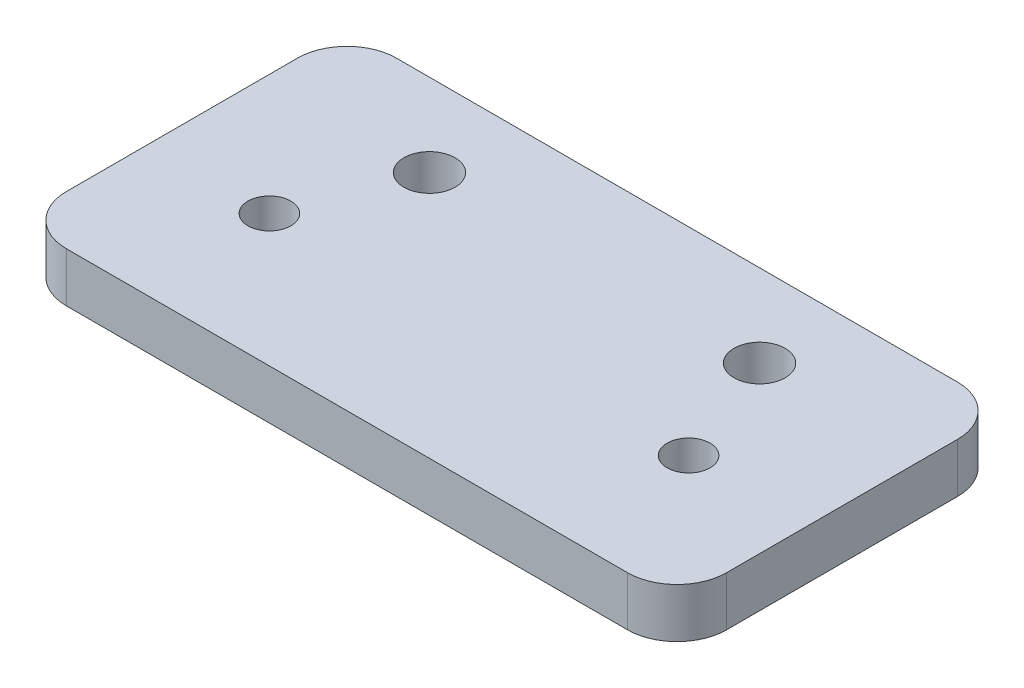
ISO-10303-21;
HEADER;
FILE_DESCRIPTION(('STEP AP214'),'2;1');
FILE_NAME('part.step','',(''),(''),'','','');
FILE_SCHEMA(('AUTOMOTIVE_DESIGN { 1 0 10303 214 1 1 1 1 }'));
ENDSEC;
DATA;
#1=APPLICATION_CONTEXT('core data for automotive mechanical design processes');
#2=APPLICATION_PROTOCOL_DEFINITION('international standard','automotive_design',2000,#1);
#3=PRODUCT_CONTEXT('',#1,'mechanical');
#4=PRODUCT('Part','Part','',(#3));
#5=PRODUCT_RELATED_PRODUCT_CATEGORY('part','',(#4));
#6=PRODUCT_DEFINITION_FORMATION('','',#4);
#7=PRODUCT_DEFINITION_CONTEXT('part definition',#1,'design');
#8=PRODUCT_DEFINITION('design','',#6,#7);
#9=PRODUCT_DEFINITION_SHAPE('','',#8);
#10=(LENGTH_UNIT() NAMED_UNIT(*) SI_UNIT(.MILLI.,.METRE.));
#11=(NAMED_UNIT(*) PLANE_ANGLE_UNIT() SI_UNIT($,.RADIAN.));
#12=(NAMED_UNIT(*) SI_UNIT($,.STERADIAN.) SOLID_ANGLE_UNIT());
#13=UNCERTAINTY_MEASURE_WITH_UNIT(LENGTH_MEASURE(1.E-05),#10,'distance_accuracy_value','');
#14=(GEOMETRIC_REPRESENTATION_CONTEXT(3) GLOBAL_UNCERTAINTY_ASSIGNED_CONTEXT((#13)) GLOBAL_UNIT_ASSIGNED_CONTEXT((#10,
#11,#12)) REPRESENTATION_CONTEXT('',''));
#15=CARTESIAN_POINT('',(0.,0.,0.));
#16=DIRECTION('',(0.,0.,1.));
#17=DIRECTION('',(1.,0.,0.));
#18=AXIS2_PLACEMENT_3D('',#15,#16,#17);
#19=CARTESIAN_POINT('',(20.,3.,15.));
#20=DIRECTION('',(-1.,0.,0.));
#21=DIRECTION('',(0.,0.,1.));
#22=AXIS2_PLACEMENT_3D('',#19,#20,#21);
#23=PLANE('',#22);
#24=DIRECTION('',(0.,0.,-1.));
#25=VECTOR('',#24,1.);
#26=CARTESIAN_POINT('',(20.,3.,15.));
#27=LINE('',#26,#25);
#28=CARTESIAN_POINT('',(20.,3.,12.));
#29=VERTEX_POINT('',#28);
#30=CARTESIAN_POINT('',(20.,3.,-1.99999999999999));
#31=VERTEX_POINT('',#30);
#32=EDGE_CURVE('E120',#29,#31,#27,.T.);
#33=ORIENTED_EDGE('',*,*,#32,.F.);
#34=DIRECTION('',(0.,-1.,0.));
#35=VECTOR('',#34,1.);
#36=CARTESIAN_POINT('',(20.,3.,12.));
#37=LINE('',#36,#35);
#38=CARTESIAN_POINT('',(20.,0.,12.));
#39=VERTEX_POINT('',#38);
#40=EDGE_CURVE('E104',#29,#39,#37,.T.);
#41=ORIENTED_EDGE('',*,*,#40,.T.);
#42=DIRECTION('',(0.,0.,-1.));
#43=VECTOR('',#42,1.);
#44=CARTESIAN_POINT('',(20.,0.,15.));
#45=LINE('',#44,#43);
#46=CARTESIAN_POINT('',(20.,0.,-1.99999999999999));
#47=VERTEX_POINT('',#46);
#48=EDGE_CURVE('E117',#39,#47,#45,.T.);
#49=ORIENTED_EDGE('',*,*,#48,.T.);
#50=DIRECTION('',(0.,1.,0.));
#51=VECTOR('',#50,1.);
#52=CARTESIAN_POINT('',(20.,3.,-1.99999999999999));
#53=LINE('',#52,#51);
#54=EDGE_CURVE('E122',#47,#31,#53,.T.);
#55=ORIENTED_EDGE('',*,*,#54,.T.);
#56=EDGE_LOOP('',(#33,#41,#49,#55));
#57=FACE_BOUND('',#56,.T.);
#58=ADVANCED_FACE('F35',(#57),#23,.F.);
#59=CARTESIAN_POINT('',(-20.,3.,15.));
#60=DIRECTION('',(1.,0.,0.));
#61=DIRECTION('',(0.,0.,-1.));
#62=AXIS2_PLACEMENT_3D('',#59,#60,#61);
#63=PLANE('',#62);
#64=DIRECTION('',(0.,0.,1.));
#65=VECTOR('',#64,1.);
#66=CARTESIAN_POINT('',(-20.,0.,15.));
#67=LINE('',#66,#65);
#68=CARTESIAN_POINT('',(-20.,0.,-1.99999999999999));
#69=VERTEX_POINT('',#68);
#70=CARTESIAN_POINT('',(-20.,0.,12.));
#71=VERTEX_POINT('',#70);
#72=EDGE_CURVE('E129',#69,#71,#67,.T.);
#73=ORIENTED_EDGE('',*,*,#72,.T.);
#74=DIRECTION('',(0.,-1.,0.));
#75=VECTOR('',#74,1.);
#76=CARTESIAN_POINT('',(-20.,3.,12.));
#77=LINE('',#76,#75);
#78=CARTESIAN_POINT('',(-20.,3.,12.));
#79=VERTEX_POINT('',#78);
#80=EDGE_CURVE('E50',#71,#79,#77,.F.);
#81=ORIENTED_EDGE('',*,*,#80,.T.);
#82=DIRECTION('',(0.,0.,1.));
#83=VECTOR('',#82,1.);
#84=CARTESIAN_POINT('',(-20.,3.,15.));
#85=LINE('',#84,#83);
#86=CARTESIAN_POINT('',(-20.,3.,-1.99999999999999));
#87=VERTEX_POINT('',#86);
#88=EDGE_CURVE('E187',#87,#79,#85,.T.);
#89=ORIENTED_EDGE('',*,*,#88,.F.);
#90=DIRECTION('',(0.,1.,0.));
#91=VECTOR('',#90,1.);
#92=CARTESIAN_POINT('',(-20.,3.,-1.99999999999999));
#93=LINE('',#92,#91);
#94=EDGE_CURVE('E156',#87,#69,#93,.F.);
#95=ORIENTED_EDGE('',*,*,#94,.T.);
#96=EDGE_LOOP('',(#73,#81,#89,#95));
#97=FACE_BOUND('',#96,.T.);
#98=ADVANCED_FACE('F196',(#97),#63,.F.);
#99=CARTESIAN_POINT('',(-20.,3.,15.));
#100=DIRECTION('',(0.,0.,-1.));
#101=DIRECTION('',(-1.,0.,0.));
#102=AXIS2_PLACEMENT_3D('',#99,#100,#101);
#103=PLANE('',#102);
#104=DIRECTION('',(1.,0.,0.));
#105=VECTOR('',#104,1.);
#106=CARTESIAN_POINT('',(-20.,0.,15.));
#107=LINE('',#106,#105);
#108=CARTESIAN_POINT('',(-17.,0.,15.));
#109=VERTEX_POINT('',#108);
#110=CARTESIAN_POINT('',(17.,0.,15.));
#111=VERTEX_POINT('',#110);
#112=EDGE_CURVE('E132',#109,#111,#107,.T.);
#113=ORIENTED_EDGE('',*,*,#112,.T.);
#114=DIRECTION('',(0.,-1.,0.));
#115=VECTOR('',#114,1.);
#116=CARTESIAN_POINT('',(17.,3.,15.));
#117=LINE('',#116,#115);
#118=CARTESIAN_POINT('',(17.,3.,15.));
#119=VERTEX_POINT('',#118);
#120=EDGE_CURVE('E105',#111,#119,#117,.F.);
#121=ORIENTED_EDGE('',*,*,#120,.T.);
#122=DIRECTION('',(1.,0.,0.));
#123=VECTOR('',#122,1.);
#124=CARTESIAN_POINT('',(-20.,3.,15.));
#125=LINE('',#124,#123);
#126=CARTESIAN_POINT('',(-17.,3.,15.));
#127=VERTEX_POINT('',#126);
#128=EDGE_CURVE('E138',#127,#119,#125,.T.);
#129=ORIENTED_EDGE('',*,*,#128,.F.);
#130=DIRECTION('',(0.,-1.,0.));
#131=VECTOR('',#130,1.);
#132=CARTESIAN_POINT('',(-17.,3.,15.));
#133=LINE('',#132,#131);
#134=EDGE_CURVE('E110',#127,#109,#133,.T.);
#135=ORIENTED_EDGE('',*,*,#134,.T.);
#136=EDGE_LOOP('',(#113,#121,#129,#135));
#137=FACE_BOUND('',#136,.T.);
#138=ADVANCED_FACE('F192',(#137),#103,.F.);
#139=CARTESIAN_POINT('',(0.,3.,0.));
#140=DIRECTION('',(0.,-1.,0.));
#141=DIRECTION('',(0.,0.,-1.));
#142=AXIS2_PLACEMENT_3D('',#139,#140,#141);
#143=PLANE('',#142);
#144=CARTESIAN_POINT('',(-12.7,3.,7.));
#145=DIRECTION('',(0.,1.,0.));
#146=DIRECTION('',(0.,0.,1.));
#147=AXIS2_PLACEMENT_3D('',#144,#145,#146);
#148=CIRCLE('',#147,1.3);
#149=CARTESIAN_POINT('',(-12.7,3.,8.3));
#150=VERTEX_POINT('',#149);
#151=EDGE_CURVE('E176',#150,#150,#148,.T.);
#152=ORIENTED_EDGE('',*,*,#151,.F.);
#153=EDGE_LOOP('',(#152));
#154=FACE_BOUND('',#153,.T.);
#155=CARTESIAN_POINT('',(12.7,3.,7.));
#156=DIRECTION('',(0.,1.,0.));
#157=DIRECTION('',(0.,0.,-1.));
#158=AXIS2_PLACEMENT_3D('',#155,#156,#157);
#159=CIRCLE('',#158,1.3);
#160=CARTESIAN_POINT('',(12.7,3.,5.7));
#161=VERTEX_POINT('',#160);
#162=EDGE_CURVE('E326',#161,#161,#159,.T.);
#163=ORIENTED_EDGE('',*,*,#162,.F.);
#164=EDGE_LOOP('',(#163));
#165=FACE_BOUND('',#164,.T.);
#166=CARTESIAN_POINT('',(-10.,3.,0.));
#167=DIRECTION('',(0.,1.,0.));
#168=DIRECTION('',(0.,0.,1.));
#169=AXIS2_PLACEMENT_3D('',#166,#167,#168);
#170=CIRCLE('',#169,1.55);
#171=CARTESIAN_POINT('',(-10.,3.,1.55));
#172=VERTEX_POINT('',#171);
#173=EDGE_CURVE('E135',#172,#172,#170,.T.);
#174=ORIENTED_EDGE('',*,*,#173,.F.);
#175=EDGE_LOOP('',(#174));
#176=FACE_BOUND('',#175,.T.);
#177=CARTESIAN_POINT('',(10.,3.,0.));
#178=DIRECTION('',(0.,1.,0.));
#179=DIRECTION('',(0.,0.,-1.));
#180=AXIS2_PLACEMENT_3D('',#177,#178,#179);
#181=CIRCLE('',#180,1.55);
#182=CARTESIAN_POINT('',(10.,3.,-1.55));
#183=VERTEX_POINT('',#182);
#184=EDGE_CURVE('E173',#183,#183,#181,.T.);
#185=ORIENTED_EDGE('',*,*,#184,.F.);
#186=EDGE_LOOP('',(#185));
#187=FACE_BOUND('',#186,.T.);
#188=ORIENTED_EDGE('',*,*,#128,.T.);
#189=CARTESIAN_POINT('',(17.,3.,12.));
#190=DIRECTION('',(0.,-1.,0.));
#191=DIRECTION('',(0.,0.,-1.));
#192=AXIS2_PLACEMENT_3D('',#189,#190,#191);
#193=CIRCLE('',#192,3.);
#194=EDGE_CURVE('E154',#119,#29,#193,.F.);
#195=ORIENTED_EDGE('',*,*,#194,.T.);
#196=ORIENTED_EDGE('',*,*,#32,.T.);
#197=CARTESIAN_POINT('',(17.,3.,-1.99999999999999));
#198=DIRECTION('',(0.,-1.,0.));
#199=DIRECTION('',(0.,0.,-1.));
#200=AXIS2_PLACEMENT_3D('',#197,#198,#199);
#201=CIRCLE('',#200,3.);
#202=CARTESIAN_POINT('',(17.,3.,-5.));
#203=VERTEX_POINT('',#202);
#204=EDGE_CURVE('E150',#31,#203,#201,.F.);
#205=ORIENTED_EDGE('',*,*,#204,.T.);
#206=DIRECTION('',(1.,0.,0.));
#207=VECTOR('',#206,1.);
#208=CARTESIAN_POINT('',(-20.,3.,-5.));
#209=LINE('',#208,#207);
#210=CARTESIAN_POINT('',(-17.,3.,-5.));
#211=VERTEX_POINT('',#210);
#212=EDGE_CURVE('E164',#211,#203,#209,.T.);
#213=ORIENTED_EDGE('',*,*,#212,.F.);
#214=CARTESIAN_POINT('',(-17.,3.,-2.));
#215=DIRECTION('',(0.,-1.,0.));
#216=DIRECTION('',(0.,0.,-1.));
#217=AXIS2_PLACEMENT_3D('',#214,#215,#216);
#218=CIRCLE('',#217,3.);
#219=EDGE_CURVE('E57',#211,#87,#218,.F.);
#220=ORIENTED_EDGE('',*,*,#219,.T.);
#221=ORIENTED_EDGE('',*,*,#88,.T.);
#222=CARTESIAN_POINT('',(-17.,3.,12.));
#223=DIRECTION('',(0.,-1.,0.));
#224=DIRECTION('',(0.,0.,-1.));
#225=AXIS2_PLACEMENT_3D('',#222,#223,#224);
#226=CIRCLE('',#225,3.);
#227=EDGE_CURVE('E152',#79,#127,#226,.F.);
#228=ORIENTED_EDGE('',*,*,#227,.T.);
#229=EDGE_LOOP('',(#188,#195,#196,#205,#213,#220,#221,#228));
#230=FACE_BOUND('',#229,.T.);
#231=ADVANCED_FACE('F170',(#154,#165,#176,#187,#230),#143,.F.);
#232=CARTESIAN_POINT('',(0.,0.,0.));
#233=DIRECTION('',(0.,-1.,0.));
#234=DIRECTION('',(0.,0.,-1.));
#235=AXIS2_PLACEMENT_3D('',#232,#233,#234);
#236=PLANE('',#235);
#237=CARTESIAN_POINT('',(-12.7,0.,7.));
#238=DIRECTION('',(0.,1.,0.));
#239=DIRECTION('',(0.,0.,1.));
#240=AXIS2_PLACEMENT_3D('',#237,#238,#239);
#241=CIRCLE('',#240,1.3);
#242=CARTESIAN_POINT('',(-12.7,0.,8.3));
#243=VERTEX_POINT('',#242);
#244=EDGE_CURVE('E171',#243,#243,#241,.T.);
#245=ORIENTED_EDGE('',*,*,#244,.T.);
#246=EDGE_LOOP('',(#245));
#247=FACE_BOUND('',#246,.T.);
#248=CARTESIAN_POINT('',(12.7,0.,7.));
#249=DIRECTION('',(0.,1.,0.));
#250=DIRECTION('',(0.,0.,-1.));
#251=AXIS2_PLACEMENT_3D('',#248,#249,#250);
#252=CIRCLE('',#251,1.3);
#253=CARTESIAN_POINT('',(12.7,0.,5.7));
#254=VERTEX_POINT('',#253);
#255=EDGE_CURVE('E323',#254,#254,#252,.T.);
#256=ORIENTED_EDGE('',*,*,#255,.T.);
#257=EDGE_LOOP('',(#256));
#258=FACE_BOUND('',#257,.T.);
#259=ORIENTED_EDGE('',*,*,#48,.F.);
#260=CARTESIAN_POINT('',(17.,0.,12.));
#261=DIRECTION('',(0.,-1.,0.));
#262=DIRECTION('',(0.,0.,-1.));
#263=AXIS2_PLACEMENT_3D('',#260,#261,#262);
#264=CIRCLE('',#263,3.);
#265=EDGE_CURVE('E100',#39,#111,#264,.T.);
#266=ORIENTED_EDGE('',*,*,#265,.T.);
#267=ORIENTED_EDGE('',*,*,#112,.F.);
#268=CARTESIAN_POINT('',(-17.,0.,12.));
#269=DIRECTION('',(0.,-1.,0.));
#270=DIRECTION('',(0.,0.,-1.));
#271=AXIS2_PLACEMENT_3D('',#268,#269,#270);
#272=CIRCLE('',#271,3.);
#273=EDGE_CURVE('E111',#109,#71,#272,.T.);
#274=ORIENTED_EDGE('',*,*,#273,.T.);
#275=ORIENTED_EDGE('',*,*,#72,.F.);
#276=CARTESIAN_POINT('',(-17.,0.,-2.));
#277=DIRECTION('',(0.,-1.,0.));
#278=DIRECTION('',(0.,0.,-1.));
#279=AXIS2_PLACEMENT_3D('',#276,#277,#278);
#280=CIRCLE('',#279,3.);
#281=CARTESIAN_POINT('',(-17.,0.,-5.));
#282=VERTEX_POINT('',#281);
#283=EDGE_CURVE('E121',#69,#282,#280,.T.);
#284=ORIENTED_EDGE('',*,*,#283,.T.);
#285=DIRECTION('',(1.,0.,0.));
#286=VECTOR('',#285,1.);
#287=CARTESIAN_POINT('',(-20.,0.,-5.));
#288=LINE('',#287,#286);
#289=CARTESIAN_POINT('',(17.,0.,-5.));
#290=VERTEX_POINT('',#289);
#291=EDGE_CURVE('E166',#282,#290,#288,.T.);
#292=ORIENTED_EDGE('',*,*,#291,.T.);
#293=CARTESIAN_POINT('',(17.,0.,-1.99999999999999));
#294=DIRECTION('',(0.,-1.,0.));
#295=DIRECTION('',(0.,0.,-1.));
#296=AXIS2_PLACEMENT_3D('',#293,#294,#295);
#297=CIRCLE('',#296,3.);
#298=EDGE_CURVE('E128',#290,#47,#297,.T.);
#299=ORIENTED_EDGE('',*,*,#298,.T.);
#300=EDGE_LOOP('',(#259,#266,#267,#274,#275,#284,#292,#299));
#301=FACE_BOUND('',#300,.T.);
#302=CARTESIAN_POINT('',(-10.,0.,0.));
#303=DIRECTION('',(0.,1.,0.));
#304=DIRECTION('',(0.,0.,1.));
#305=AXIS2_PLACEMENT_3D('',#302,#303,#304);
#306=CIRCLE('',#305,1.55);
#307=CARTESIAN_POINT('',(-10.,0.,1.55));
#308=VERTEX_POINT('',#307);
#309=EDGE_CURVE('E130',#308,#308,#306,.T.);
#310=ORIENTED_EDGE('',*,*,#309,.T.);
#311=EDGE_LOOP('',(#310));
#312=FACE_BOUND('',#311,.T.);
#313=CARTESIAN_POINT('',(10.,0.,0.));
#314=DIRECTION('',(0.,1.,0.));
#315=DIRECTION('',(0.,0.,-1.));
#316=AXIS2_PLACEMENT_3D('',#313,#314,#315);
#317=CIRCLE('',#316,1.55);
#318=CARTESIAN_POINT('',(10.,0.,-1.55));
#319=VERTEX_POINT('',#318);
#320=EDGE_CURVE('E182',#319,#319,#317,.T.);
#321=ORIENTED_EDGE('',*,*,#320,.T.);
#322=EDGE_LOOP('',(#321));
#323=FACE_BOUND('',#322,.T.);
#324=ADVANCED_FACE('F124',(#247,#258,#301,#312,#323),#236,.T.);
#325=CARTESIAN_POINT('',(10.,0.,0.));
#326=DIRECTION('',(0.,1.,0.));
#327=DIRECTION('',(0.,0.,1.));
#328=AXIS2_PLACEMENT_3D('',#325,#326,#327);
#329=CYLINDRICAL_SURFACE('',#328,1.55);
#330=ORIENTED_EDGE('',*,*,#320,.F.);
#331=EDGE_LOOP('',(#330));
#332=FACE_BOUND('',#331,.T.);
#333=ORIENTED_EDGE('',*,*,#184,.T.);
#334=EDGE_LOOP('',(#333));
#335=FACE_BOUND('',#334,.T.);
#336=ADVANCED_FACE('F224',(#332,#335),#329,.F.);
#337=CARTESIAN_POINT('',(-10.,0.,0.));
#338=DIRECTION('',(0.,1.,0.));
#339=DIRECTION('',(0.,0.,1.));
#340=AXIS2_PLACEMENT_3D('',#337,#338,#339);
#341=CYLINDRICAL_SURFACE('',#340,1.55);
#342=ORIENTED_EDGE('',*,*,#309,.F.);
#343=EDGE_LOOP('',(#342));
#344=FACE_BOUND('',#343,.T.);
#345=ORIENTED_EDGE('',*,*,#173,.T.);
#346=EDGE_LOOP('',(#345));
#347=FACE_BOUND('',#346,.T.);
#348=ADVANCED_FACE('F219',(#344,#347),#341,.F.);
#349=CARTESIAN_POINT('',(-20.,0.,-5.));
#350=DIRECTION('',(0.,0.,1.));
#351=DIRECTION('',(1.,0.,0.));
#352=AXIS2_PLACEMENT_3D('',#349,#350,#351);
#353=PLANE('',#352);
#354=ORIENTED_EDGE('',*,*,#212,.T.);
#355=DIRECTION('',(0.,1.,0.));
#356=VECTOR('',#355,1.);
#357=CARTESIAN_POINT('',(17.,0.,-5.));
#358=LINE('',#357,#356);
#359=EDGE_CURVE('E11',#203,#290,#358,.F.);
#360=ORIENTED_EDGE('',*,*,#359,.T.);
#361=ORIENTED_EDGE('',*,*,#291,.F.);
#362=DIRECTION('',(0.,1.,0.));
#363=VECTOR('',#362,1.);
#364=CARTESIAN_POINT('',(-17.,0.,-5.));
#365=LINE('',#364,#363);
#366=EDGE_CURVE('E43',#282,#211,#365,.T.);
#367=ORIENTED_EDGE('',*,*,#366,.T.);
#368=EDGE_LOOP('',(#354,#360,#361,#367));
#369=FACE_BOUND('',#368,.T.);
#370=ADVANCED_FACE('F163',(#369),#353,.F.);
#371=CARTESIAN_POINT('',(17.,3.,12.));
#372=DIRECTION('',(0.,-1.,0.));
#373=DIRECTION('',(0.,0.,-1.));
#374=AXIS2_PLACEMENT_3D('',#371,#372,#373);
#375=CYLINDRICAL_SURFACE('',#374,3.);
#376=ORIENTED_EDGE('',*,*,#194,.F.);
#377=ORIENTED_EDGE('',*,*,#120,.F.);
#378=ORIENTED_EDGE('',*,*,#265,.F.);
#379=ORIENTED_EDGE('',*,*,#40,.F.);
#380=EDGE_LOOP('',(#376,#377,#378,#379));
#381=FACE_BOUND('',#380,.T.);
#382=ADVANCED_FACE('F103',(#381),#375,.T.);
#383=CARTESIAN_POINT('',(-17.,3.,12.));
#384=DIRECTION('',(0.,-1.,0.));
#385=DIRECTION('',(0.,0.,-1.));
#386=AXIS2_PLACEMENT_3D('',#383,#384,#385);
#387=CYLINDRICAL_SURFACE('',#386,3.);
#388=ORIENTED_EDGE('',*,*,#227,.F.);
#389=ORIENTED_EDGE('',*,*,#80,.F.);
#390=ORIENTED_EDGE('',*,*,#273,.F.);
#391=ORIENTED_EDGE('',*,*,#134,.F.);
#392=EDGE_LOOP('',(#388,#389,#390,#391));
#393=FACE_BOUND('',#392,.T.);
#394=ADVANCED_FACE('F194',(#393),#387,.T.);
#395=CARTESIAN_POINT('',(17.,3.,-1.99999999999999));
#396=DIRECTION('',(0.,1.,0.));
#397=DIRECTION('',(0.,0.,1.));
#398=AXIS2_PLACEMENT_3D('',#395,#396,#397);
#399=CYLINDRICAL_SURFACE('',#398,3.);
#400=ORIENTED_EDGE('',*,*,#298,.F.);
#401=ORIENTED_EDGE('',*,*,#359,.F.);
#402=ORIENTED_EDGE('',*,*,#204,.F.);
#403=ORIENTED_EDGE('',*,*,#54,.F.);
#404=EDGE_LOOP('',(#400,#401,#402,#403));
#405=FACE_BOUND('',#404,.T.);
#406=ADVANCED_FACE('F199',(#405),#399,.T.);
#407=CARTESIAN_POINT('',(-17.,0.,-2.));
#408=DIRECTION('',(0.,1.,0.));
#409=DIRECTION('',(0.,0.,1.));
#410=AXIS2_PLACEMENT_3D('',#407,#408,#409);
#411=CYLINDRICAL_SURFACE('',#410,3.);
#412=ORIENTED_EDGE('',*,*,#283,.F.);
#413=ORIENTED_EDGE('',*,*,#94,.F.);
#414=ORIENTED_EDGE('',*,*,#219,.F.);
#415=ORIENTED_EDGE('',*,*,#366,.F.);
#416=EDGE_LOOP('',(#412,#413,#414,#415));
#417=FACE_BOUND('',#416,.T.);
#418=ADVANCED_FACE('F37',(#417),#411,.T.);
#419=CARTESIAN_POINT('',(12.7,0.,7.));
#420=DIRECTION('',(0.,1.,0.));
#421=DIRECTION('',(0.,0.,1.));
#422=AXIS2_PLACEMENT_3D('',#419,#420,#421);
#423=CYLINDRICAL_SURFACE('',#422,1.3);
#424=ORIENTED_EDGE('',*,*,#255,.F.);
#425=EDGE_LOOP('',(#424));
#426=FACE_BOUND('',#425,.T.);
#427=ORIENTED_EDGE('',*,*,#162,.T.);
#428=EDGE_LOOP('',(#427));
#429=FACE_BOUND('',#428,.T.);
#430=ADVANCED_FACE('F205',(#426,#429),#423,.F.);
#431=CARTESIAN_POINT('',(-12.7,0.,7.));
#432=DIRECTION('',(0.,1.,0.));
#433=DIRECTION('',(0.,0.,1.));
#434=AXIS2_PLACEMENT_3D('',#431,#432,#433);
#435=CYLINDRICAL_SURFACE('',#434,1.3);
#436=ORIENTED_EDGE('',*,*,#244,.F.);
#437=EDGE_LOOP('',(#436));
#438=FACE_BOUND('',#437,.T.);
#439=ORIENTED_EDGE('',*,*,#151,.T.);
#440=EDGE_LOOP('',(#439));
#441=FACE_BOUND('',#440,.T.);
#442=ADVANCED_FACE('F307',(#438,#441),#435,.F.);
#443=CLOSED_SHELL('',(#58,#98,#138,#231,#324,#336,#348,#370,#382,#394,#406,#418,#430,#442));
#444=MANIFOLD_SOLID_BREP('B2',#443);
#445=ADVANCED_BREP_SHAPE_REPRESENTATION('',(#18,#444),#14);
#446=SHAPE_DEFINITION_REPRESENTATION(#9,#445);
ENDSEC;
END-ISO-10303-21;
